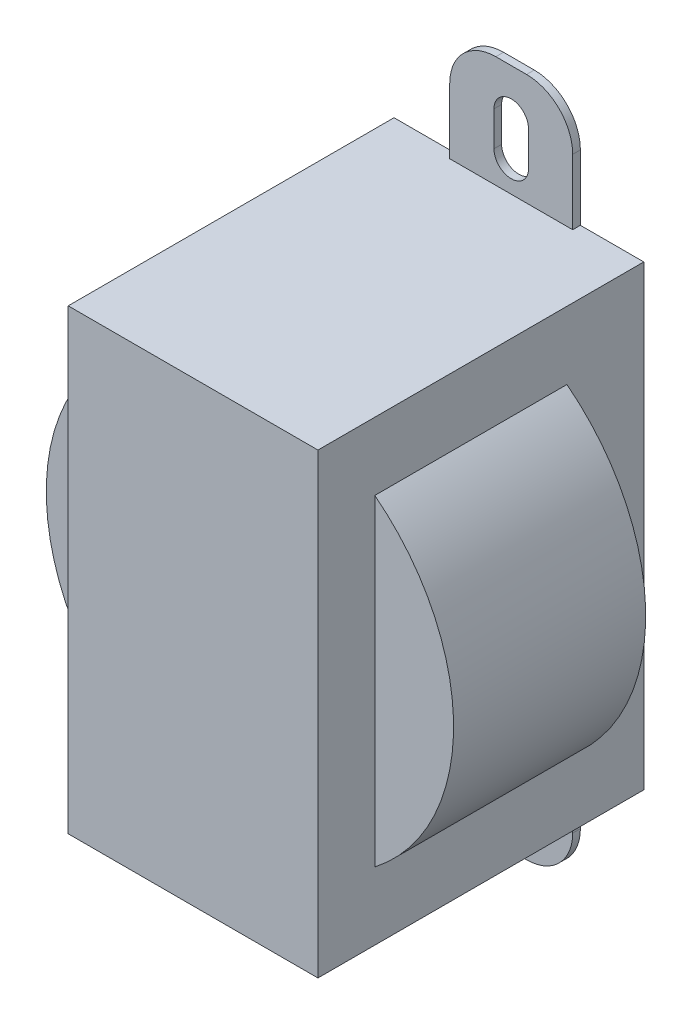
ISO-10303-21;
HEADER;
FILE_DESCRIPTION(('STEP AP214'),'2;1');
FILE_NAME('part.step','',(''),(''),'','','');
FILE_SCHEMA(('AUTOMOTIVE_DESIGN { 1 0 10303 214 1 1 1 1 }'));
ENDSEC;
DATA;
#1=APPLICATION_CONTEXT('core data for automotive mechanical design processes');
#2=APPLICATION_PROTOCOL_DEFINITION('international standard','automotive_design',2000,#1);
#3=PRODUCT_CONTEXT('',#1,'mechanical');
#4=PRODUCT('Part','Part','',(#3));
#5=PRODUCT_RELATED_PRODUCT_CATEGORY('part','',(#4));
#6=PRODUCT_DEFINITION_FORMATION('','',#4);
#7=PRODUCT_DEFINITION_CONTEXT('part definition',#1,'design');
#8=PRODUCT_DEFINITION('design','',#6,#7);
#9=PRODUCT_DEFINITION_SHAPE('','',#8);
#10=(LENGTH_UNIT() NAMED_UNIT(*) SI_UNIT(.MILLI.,.METRE.));
#11=(NAMED_UNIT(*) PLANE_ANGLE_UNIT() SI_UNIT($,.RADIAN.));
#12=(NAMED_UNIT(*) SI_UNIT($,.STERADIAN.) SOLID_ANGLE_UNIT());
#13=UNCERTAINTY_MEASURE_WITH_UNIT(LENGTH_MEASURE(1.E-05),#10,'distance_accuracy_value','');
#14=(GEOMETRIC_REPRESENTATION_CONTEXT(3) GLOBAL_UNCERTAINTY_ASSIGNED_CONTEXT((#13)) GLOBAL_UNIT_ASSIGNED_CONTEXT((#10,
#11,#12)) REPRESENTATION_CONTEXT('',''));
#15=CARTESIAN_POINT('',(0.,0.,0.));
#16=DIRECTION('',(0.,0.,1.));
#17=DIRECTION('',(1.,0.,0.));
#18=AXIS2_PLACEMENT_3D('',#15,#16,#17);
#19=CARTESIAN_POINT('',(-16.2500000000001,-29.7500000000001,42.4));
#20=DIRECTION('',(0.,1.,0.));
#21=DIRECTION('',(-1.,0.,0.));
#22=AXIS2_PLACEMENT_3D('',#19,#20,#21);
#23=PLANE('',#22);
#24=DIRECTION('',(0.,0.,-1.));
#25=VECTOR('',#24,1.);
#26=CARTESIAN_POINT('',(-7.99999999999999,-29.7500000000001,1.));
#27=LINE('',#26,#25);
#28=CARTESIAN_POINT('',(-7.99999999999999,-29.7500000000001,1.));
#29=VERTEX_POINT('',#28);
#30=CARTESIAN_POINT('',(-7.99999999999999,-29.7500000000001,0.));
#31=VERTEX_POINT('',#30);
#32=EDGE_CURVE('E299',#29,#31,#27,.T.);
#33=ORIENTED_EDGE('',*,*,#32,.F.);
#34=DIRECTION('',(-1.,0.,0.));
#35=VECTOR('',#34,1.);
#36=CARTESIAN_POINT('',(-7.99999999999999,-29.7500000000001,1.));
#37=LINE('',#36,#35);
#38=CARTESIAN_POINT('',(7.99999999999999,-29.7500000000002,1.));
#39=VERTEX_POINT('',#38);
#40=EDGE_CURVE('E282',#39,#29,#37,.T.);
#41=ORIENTED_EDGE('',*,*,#40,.F.);
#42=DIRECTION('',(0.,0.,-1.));
#43=VECTOR('',#42,1.);
#44=CARTESIAN_POINT('',(7.99999999999999,-29.7500000000002,1.));
#45=LINE('',#44,#43);
#46=CARTESIAN_POINT('',(7.99999999999999,-29.7500000000001,0.));
#47=VERTEX_POINT('',#46);
#48=EDGE_CURVE('E305',#39,#47,#45,.T.);
#49=ORIENTED_EDGE('',*,*,#48,.T.);
#50=DIRECTION('',(1.,0.,0.));
#51=VECTOR('',#50,1.);
#52=CARTESIAN_POINT('',(-16.2500000000001,-29.7500000000001,0.));
#53=LINE('',#52,#51);
#54=CARTESIAN_POINT('',(16.25,-29.7500000000001,0.));
#55=VERTEX_POINT('',#54);
#56=EDGE_CURVE('E308',#47,#55,#53,.T.);
#57=ORIENTED_EDGE('',*,*,#56,.T.);
#58=DIRECTION('',(0.,0.,-1.));
#59=VECTOR('',#58,1.);
#60=CARTESIAN_POINT('',(16.25,-29.7500000000001,42.4));
#61=LINE('',#60,#59);
#62=CARTESIAN_POINT('',(16.25,-29.7500000000001,42.4));
#63=VERTEX_POINT('',#62);
#64=EDGE_CURVE('E377',#63,#55,#61,.T.);
#65=ORIENTED_EDGE('',*,*,#64,.F.);
#66=DIRECTION('',(1.,0.,0.));
#67=VECTOR('',#66,1.);
#68=CARTESIAN_POINT('',(-16.2500000000001,-29.7500000000001,42.4));
#69=LINE('',#68,#67);
#70=CARTESIAN_POINT('',(-16.2500000000001,-29.7500000000001,42.4));
#71=VERTEX_POINT('',#70);
#72=EDGE_CURVE('E389',#71,#63,#69,.T.);
#73=ORIENTED_EDGE('',*,*,#72,.F.);
#74=DIRECTION('',(0.,0.,-1.));
#75=VECTOR('',#74,1.);
#76=CARTESIAN_POINT('',(-16.2500000000001,-29.7500000000001,42.4));
#77=LINE('',#76,#75);
#78=CARTESIAN_POINT('',(-16.2500000000001,-29.7500000000001,0.));
#79=VERTEX_POINT('',#78);
#80=EDGE_CURVE('E349',#71,#79,#77,.T.);
#81=ORIENTED_EDGE('',*,*,#80,.T.);
#82=EDGE_CURVE('E347',#79,#31,#53,.T.);
#83=ORIENTED_EDGE('',*,*,#82,.T.);
#84=EDGE_LOOP('',(#33,#41,#49,#57,#65,#73,#81,#83));
#85=FACE_BOUND('',#84,.T.);
#86=ADVANCED_FACE('F38',(#85),#23,.F.);
#87=CARTESIAN_POINT('',(-16.2500000000001,29.7500000000001,42.4));
#88=DIRECTION('',(0.,-1.,0.));
#89=DIRECTION('',(1.,0.,0.));
#90=AXIS2_PLACEMENT_3D('',#87,#88,#89);
#91=PLANE('',#90);
#92=DIRECTION('',(0.,0.,-1.));
#93=VECTOR('',#92,1.);
#94=CARTESIAN_POINT('',(7.99999999999999,29.7500000000001,0.999999999999999));
#95=LINE('',#94,#93);
#96=CARTESIAN_POINT('',(7.99999999999999,29.7500000000001,0.999999999999999));
#97=VERTEX_POINT('',#96);
#98=CARTESIAN_POINT('',(7.99999999999999,29.7500000000001,0.));
#99=VERTEX_POINT('',#98);
#100=EDGE_CURVE('E445',#97,#99,#95,.T.);
#101=ORIENTED_EDGE('',*,*,#100,.F.);
#102=DIRECTION('',(1.,0.,0.));
#103=VECTOR('',#102,1.);
#104=CARTESIAN_POINT('',(-7.99999999999999,29.7500000000001,1.));
#105=LINE('',#104,#103);
#106=CARTESIAN_POINT('',(-7.99999999999999,29.7500000000001,1.));
#107=VERTEX_POINT('',#106);
#108=EDGE_CURVE('E442',#107,#97,#105,.T.);
#109=ORIENTED_EDGE('',*,*,#108,.F.);
#110=DIRECTION('',(0.,0.,-1.));
#111=VECTOR('',#110,1.);
#112=CARTESIAN_POINT('',(-7.99999999999999,29.7500000000001,1.));
#113=LINE('',#112,#111);
#114=CARTESIAN_POINT('',(-7.99999999999999,29.7500000000001,0.));
#115=VERTEX_POINT('',#114);
#116=EDGE_CURVE('E439',#107,#115,#113,.T.);
#117=ORIENTED_EDGE('',*,*,#116,.T.);
#118=DIRECTION('',(-1.,0.,0.));
#119=VECTOR('',#118,1.);
#120=CARTESIAN_POINT('',(-16.2500000000001,29.7500000000001,0.));
#121=LINE('',#120,#119);
#122=CARTESIAN_POINT('',(-16.2500000000001,29.7500000000001,0.));
#123=VERTEX_POINT('',#122);
#124=EDGE_CURVE('E352',#115,#123,#121,.T.);
#125=ORIENTED_EDGE('',*,*,#124,.T.);
#126=DIRECTION('',(0.,0.,-1.));
#127=VECTOR('',#126,1.);
#128=CARTESIAN_POINT('',(-16.2500000000001,29.7500000000001,42.4));
#129=LINE('',#128,#127);
#130=CARTESIAN_POINT('',(-16.2500000000001,29.7500000000001,42.4));
#131=VERTEX_POINT('',#130);
#132=EDGE_CURVE('E383',#131,#123,#129,.T.);
#133=ORIENTED_EDGE('',*,*,#132,.F.);
#134=DIRECTION('',(-1.,0.,0.));
#135=VECTOR('',#134,1.);
#136=CARTESIAN_POINT('',(-16.2500000000001,29.7500000000001,42.4));
#137=LINE('',#136,#135);
#138=CARTESIAN_POINT('',(16.25,29.7500000000001,42.4));
#139=VERTEX_POINT('',#138);
#140=EDGE_CURVE('E386',#139,#131,#137,.T.);
#141=ORIENTED_EDGE('',*,*,#140,.F.);
#142=DIRECTION('',(0.,0.,-1.));
#143=VECTOR('',#142,1.);
#144=CARTESIAN_POINT('',(16.25,29.7500000000001,42.4));
#145=LINE('',#144,#143);
#146=CARTESIAN_POINT('',(16.25,29.7500000000001,0.));
#147=VERTEX_POINT('',#146);
#148=EDGE_CURVE('E380',#139,#147,#145,.T.);
#149=ORIENTED_EDGE('',*,*,#148,.T.);
#150=EDGE_CURVE('E371',#147,#99,#121,.T.);
#151=ORIENTED_EDGE('',*,*,#150,.T.);
#152=EDGE_LOOP('',(#101,#109,#117,#125,#133,#141,#149,#151));
#153=FACE_BOUND('',#152,.T.);
#154=ADVANCED_FACE('F491',(#153),#91,.F.);
#155=CARTESIAN_POINT('',(-16.2500000000001,29.7500000000001,42.4));
#156=DIRECTION('',(1.,0.,0.));
#157=DIRECTION('',(0.,1.,0.));
#158=AXIS2_PLACEMENT_3D('',#155,#156,#157);
#159=PLANE('',#158);
#160=DIRECTION('',(0.,0.,-1.));
#161=VECTOR('',#160,1.);
#162=CARTESIAN_POINT('',(-16.2500000000001,20.9329286054293,35.));
#163=LINE('',#162,#161);
#164=CARTESIAN_POINT('',(-16.2500000000001,20.9329286054293,35.));
#165=VERTEX_POINT('',#164);
#166=CARTESIAN_POINT('',(-16.2500000000001,20.9329286054293,10.));
#167=VERTEX_POINT('',#166);
#168=EDGE_CURVE('E414',#165,#167,#163,.T.);
#169=ORIENTED_EDGE('',*,*,#168,.F.);
#170=DIRECTION('',(0.,-1.,0.));
#171=VECTOR('',#170,1.);
#172=CARTESIAN_POINT('',(-16.2500000000001,29.7500000000001,35.));
#173=LINE('',#172,#171);
#174=CARTESIAN_POINT('',(-16.25,-20.9329286054293,35.));
#175=VERTEX_POINT('',#174);
#176=EDGE_CURVE('E399',#165,#175,#173,.T.);
#177=ORIENTED_EDGE('',*,*,#176,.T.);
#178=DIRECTION('',(0.,0.,-1.));
#179=VECTOR('',#178,1.);
#180=CARTESIAN_POINT('',(-16.2500000000001,-20.9329286054293,35.));
#181=LINE('',#180,#179);
#182=CARTESIAN_POINT('',(-16.2500000000001,-20.9329286054293,10.));
#183=VERTEX_POINT('',#182);
#184=EDGE_CURVE('E405',#175,#183,#181,.T.);
#185=ORIENTED_EDGE('',*,*,#184,.T.);
#186=DIRECTION('',(0.,-1.,0.));
#187=VECTOR('',#186,1.);
#188=CARTESIAN_POINT('',(-16.2500000000001,29.7500000000001,10.));
#189=LINE('',#188,#187);
#190=EDGE_CURVE('E400',#167,#183,#189,.T.);
#191=ORIENTED_EDGE('',*,*,#190,.F.);
#192=EDGE_LOOP('',(#169,#177,#185,#191));
#193=FACE_BOUND('',#192,.T.);
#194=DIRECTION('',(0.,-1.,0.));
#195=VECTOR('',#194,1.);
#196=CARTESIAN_POINT('',(-16.2500000000001,29.7500000000001,0.));
#197=LINE('',#196,#195);
#198=EDGE_CURVE('E354',#123,#79,#197,.T.);
#199=ORIENTED_EDGE('',*,*,#198,.T.);
#200=ORIENTED_EDGE('',*,*,#80,.F.);
#201=DIRECTION('',(0.,-1.,0.));
#202=VECTOR('',#201,1.);
#203=CARTESIAN_POINT('',(-16.2500000000001,29.7500000000001,42.4));
#204=LINE('',#203,#202);
#205=EDGE_CURVE('E365',#131,#71,#204,.T.);
#206=ORIENTED_EDGE('',*,*,#205,.F.);
#207=ORIENTED_EDGE('',*,*,#132,.T.);
#208=EDGE_LOOP('',(#199,#200,#206,#207));
#209=FACE_BOUND('',#208,.T.);
#210=ADVANCED_FACE('F40',(#193,#209),#159,.F.);
#211=CARTESIAN_POINT('',(16.25,29.7500000000001,42.4));
#212=DIRECTION('',(-1.,0.,0.));
#213=DIRECTION('',(0.,-1.,0.));
#214=AXIS2_PLACEMENT_3D('',#211,#212,#213);
#215=PLANE('',#214);
#216=DIRECTION('',(0.,0.,-1.));
#217=VECTOR('',#216,1.);
#218=CARTESIAN_POINT('',(16.25,-20.9329286054293,35.));
#219=LINE('',#218,#217);
#220=CARTESIAN_POINT('',(16.25,-20.9329286054293,35.));
#221=VERTEX_POINT('',#220);
#222=CARTESIAN_POINT('',(16.25,-20.9329286054293,10.));
#223=VERTEX_POINT('',#222);
#224=EDGE_CURVE('E409',#221,#223,#219,.T.);
#225=ORIENTED_EDGE('',*,*,#224,.F.);
#226=DIRECTION('',(0.,1.,0.));
#227=VECTOR('',#226,1.);
#228=CARTESIAN_POINT('',(16.25,29.7500000000001,35.));
#229=LINE('',#228,#227);
#230=CARTESIAN_POINT('',(16.25,20.9329286054293,35.));
#231=VERTEX_POINT('',#230);
#232=EDGE_CURVE('E11',#221,#231,#229,.T.);
#233=ORIENTED_EDGE('',*,*,#232,.T.);
#234=DIRECTION('',(0.,0.,-1.));
#235=VECTOR('',#234,1.);
#236=CARTESIAN_POINT('',(16.25,20.9329286054293,35.));
#237=LINE('',#236,#235);
#238=CARTESIAN_POINT('',(16.25,20.9329286054293,10.));
#239=VERTEX_POINT('',#238);
#240=EDGE_CURVE('E412',#231,#239,#237,.T.);
#241=ORIENTED_EDGE('',*,*,#240,.T.);
#242=DIRECTION('',(0.,1.,0.));
#243=VECTOR('',#242,1.);
#244=CARTESIAN_POINT('',(16.25,29.7500000000001,10.));
#245=LINE('',#244,#243);
#246=EDGE_CURVE('E47',#223,#239,#245,.T.);
#247=ORIENTED_EDGE('',*,*,#246,.F.);
#248=EDGE_LOOP('',(#225,#233,#241,#247));
#249=FACE_BOUND('',#248,.T.);
#250=DIRECTION('',(0.,1.,0.));
#251=VECTOR('',#250,1.);
#252=CARTESIAN_POINT('',(16.25,29.7500000000001,0.));
#253=LINE('',#252,#251);
#254=EDGE_CURVE('E351',#55,#147,#253,.T.);
#255=ORIENTED_EDGE('',*,*,#254,.T.);
#256=ORIENTED_EDGE('',*,*,#148,.F.);
#257=DIRECTION('',(0.,1.,0.));
#258=VECTOR('',#257,1.);
#259=CARTESIAN_POINT('',(16.25,29.7500000000001,42.4));
#260=LINE('',#259,#258);
#261=EDGE_CURVE('E388',#63,#139,#260,.T.);
#262=ORIENTED_EDGE('',*,*,#261,.F.);
#263=ORIENTED_EDGE('',*,*,#64,.T.);
#264=EDGE_LOOP('',(#255,#256,#262,#263));
#265=FACE_BOUND('',#264,.T.);
#266=ADVANCED_FACE('F527',(#249,#265),#215,.F.);
#267=CARTESIAN_POINT('',(-16.2500000000001,-29.7500000000001,42.4));
#268=DIRECTION('',(0.,0.,1.));
#269=DIRECTION('',(1.,0.,0.));
#270=AXIS2_PLACEMENT_3D('',#267,#268,#269);
#271=PLANE('',#270);
#272=ORIENTED_EDGE('',*,*,#205,.T.);
#273=ORIENTED_EDGE('',*,*,#72,.T.);
#274=ORIENTED_EDGE('',*,*,#261,.T.);
#275=ORIENTED_EDGE('',*,*,#140,.T.);
#276=EDGE_LOOP('',(#272,#273,#274,#275));
#277=FACE_BOUND('',#276,.T.);
#278=ADVANCED_FACE('F394',(#277),#271,.T.);
#279=CARTESIAN_POINT('',(-16.2500000000001,-29.7500000000001,0.));
#280=DIRECTION('',(0.,0.,1.));
#281=DIRECTION('',(1.,0.,0.));
#282=AXIS2_PLACEMENT_3D('',#279,#280,#281);
#283=PLANE('',#282);
#284=ORIENTED_EDGE('',*,*,#198,.F.);
#285=ORIENTED_EDGE('',*,*,#124,.F.);
#286=DIRECTION('',(0.,-1.,0.));
#287=VECTOR('',#286,1.);
#288=CARTESIAN_POINT('',(-8.,38.2500000000001,0.));
#289=LINE('',#288,#287);
#290=CARTESIAN_POINT('',(-8.,38.2500000000001,0.));
#291=VERTEX_POINT('',#290);
#292=EDGE_CURVE('E63',#291,#115,#289,.T.);
#293=ORIENTED_EDGE('',*,*,#292,.F.);
#294=CARTESIAN_POINT('',(-2.,38.2500000000001,0.));
#295=DIRECTION('',(0.,0.,1.));
#296=DIRECTION('',(-1.,0.,0.));
#297=AXIS2_PLACEMENT_3D('',#294,#295,#296);
#298=CIRCLE('',#297,6.);
#299=CARTESIAN_POINT('',(-1.99999999999996,44.2500000000001,0.));
#300=VERTEX_POINT('',#299);
#301=EDGE_CURVE('E448',#300,#291,#298,.T.);
#302=ORIENTED_EDGE('',*,*,#301,.F.);
#303=DIRECTION('',(-1.,0.,0.));
#304=VECTOR('',#303,1.);
#305=CARTESIAN_POINT('',(-1.99999999999996,44.2500000000001,0.));
#306=LINE('',#305,#304);
#307=CARTESIAN_POINT('',(1.99999999999999,44.2500000000001,0.));
#308=VERTEX_POINT('',#307);
#309=EDGE_CURVE('E460',#308,#300,#306,.T.);
#310=ORIENTED_EDGE('',*,*,#309,.F.);
#311=CARTESIAN_POINT('',(1.99999999999999,38.2500000000001,0.));
#312=DIRECTION('',(0.,0.,1.));
#313=DIRECTION('',(1.,0.,0.));
#314=AXIS2_PLACEMENT_3D('',#311,#312,#313);
#315=CIRCLE('',#314,6.);
#316=CARTESIAN_POINT('',(7.99999999999999,38.2500000000001,0.));
#317=VERTEX_POINT('',#316);
#318=EDGE_CURVE('E455',#317,#308,#315,.T.);
#319=ORIENTED_EDGE('',*,*,#318,.F.);
#320=DIRECTION('',(0.,1.,0.));
#321=VECTOR('',#320,1.);
#322=CARTESIAN_POINT('',(7.99999999999999,38.2500000000001,0.));
#323=LINE('',#322,#321);
#324=EDGE_CURVE('E453',#99,#317,#323,.T.);
#325=ORIENTED_EDGE('',*,*,#324,.F.);
#326=ORIENTED_EDGE('',*,*,#150,.F.);
#327=ORIENTED_EDGE('',*,*,#254,.F.);
#328=ORIENTED_EDGE('',*,*,#56,.F.);
#329=DIRECTION('',(0.,1.,0.));
#330=VECTOR('',#329,1.);
#331=CARTESIAN_POINT('',(7.99999999999999,-38.2500000000001,0.));
#332=LINE('',#331,#330);
#333=CARTESIAN_POINT('',(7.99999999999999,-38.2500000000001,0.));
#334=VERTEX_POINT('',#333);
#335=EDGE_CURVE('E55',#334,#47,#332,.T.);
#336=ORIENTED_EDGE('',*,*,#335,.F.);
#337=CARTESIAN_POINT('',(1.99999999999999,-38.2500000000001,0.));
#338=DIRECTION('',(0.,0.,1.));
#339=DIRECTION('',(-1.,0.,0.));
#340=AXIS2_PLACEMENT_3D('',#337,#338,#339);
#341=CIRCLE('',#340,6.);
#342=CARTESIAN_POINT('',(1.99999999999999,-44.2500000000001,0.));
#343=VERTEX_POINT('',#342);
#344=EDGE_CURVE('E247',#343,#334,#341,.T.);
#345=ORIENTED_EDGE('',*,*,#344,.F.);
#346=DIRECTION('',(1.,0.,0.));
#347=VECTOR('',#346,1.);
#348=CARTESIAN_POINT('',(-1.99999999999996,-44.2500000000001,0.));
#349=LINE('',#348,#347);
#350=CARTESIAN_POINT('',(-1.99999999999996,-44.2500000000001,0.));
#351=VERTEX_POINT('',#350);
#352=EDGE_CURVE('E274',#351,#343,#349,.T.);
#353=ORIENTED_EDGE('',*,*,#352,.F.);
#354=CARTESIAN_POINT('',(-2.,-38.2500000000001,0.));
#355=DIRECTION('',(0.,0.,1.));
#356=DIRECTION('',(1.,0.,0.));
#357=AXIS2_PLACEMENT_3D('',#354,#355,#356);
#358=CIRCLE('',#357,6.);
#359=CARTESIAN_POINT('',(-8.,-38.2500000000001,0.));
#360=VERTEX_POINT('',#359);
#361=EDGE_CURVE('E272',#360,#351,#358,.T.);
#362=ORIENTED_EDGE('',*,*,#361,.F.);
#363=DIRECTION('',(0.,-1.,0.));
#364=VECTOR('',#363,1.);
#365=CARTESIAN_POINT('',(-8.,-38.2500000000001,0.));
#366=LINE('',#365,#364);
#367=EDGE_CURVE('E275',#31,#360,#366,.T.);
#368=ORIENTED_EDGE('',*,*,#367,.F.);
#369=ORIENTED_EDGE('',*,*,#82,.F.);
#370=EDGE_LOOP('',(#284,#285,#293,#302,#310,#319,#325,#326,#327,#328,#336,#345,#353,#362,#368,#369));
#371=FACE_BOUND('',#370,.T.);
#372=DIRECTION('',(0.,1.,0.));
#373=VECTOR('',#372,1.);
#374=CARTESIAN_POINT('',(2.25,38.2500000000001,0.));
#375=LINE('',#374,#373);
#376=CARTESIAN_POINT('',(2.25,33.7500000000001,0.));
#377=VERTEX_POINT('',#376);
#378=CARTESIAN_POINT('',(2.25,38.2500000000001,0.));
#379=VERTEX_POINT('',#378);
#380=EDGE_CURVE('E809',#377,#379,#375,.T.);
#381=ORIENTED_EDGE('',*,*,#380,.T.);
#382=CARTESIAN_POINT('',(0.,38.2500000000001,0.));
#383=DIRECTION('',(0.,0.,1.));
#384=DIRECTION('',(1.,0.,0.));
#385=AXIS2_PLACEMENT_3D('',#382,#383,#384);
#386=CIRCLE('',#385,2.25);
#387=CARTESIAN_POINT('',(-2.25,38.2500000000001,0.));
#388=VERTEX_POINT('',#387);
#389=EDGE_CURVE('E800',#379,#388,#386,.T.);
#390=ORIENTED_EDGE('',*,*,#389,.T.);
#391=DIRECTION('',(0.,-1.,0.));
#392=VECTOR('',#391,1.);
#393=CARTESIAN_POINT('',(-2.25,38.2500000000001,0.));
#394=LINE('',#393,#392);
#395=CARTESIAN_POINT('',(-2.25,33.7500000000001,0.));
#396=VERTEX_POINT('',#395);
#397=EDGE_CURVE('E801',#388,#396,#394,.T.);
#398=ORIENTED_EDGE('',*,*,#397,.T.);
#399=CARTESIAN_POINT('',(0.,33.7500000000001,0.));
#400=DIRECTION('',(0.,0.,1.));
#401=DIRECTION('',(1.,0.,0.));
#402=AXIS2_PLACEMENT_3D('',#399,#400,#401);
#403=CIRCLE('',#402,2.25);
#404=EDGE_CURVE('E804',#396,#377,#403,.T.);
#405=ORIENTED_EDGE('',*,*,#404,.T.);
#406=EDGE_LOOP('',(#381,#390,#398,#405));
#407=FACE_BOUND('',#406,.T.);
#408=DIRECTION('',(0.,-1.,0.));
#409=VECTOR('',#408,1.);
#410=CARTESIAN_POINT('',(-2.25,-38.2500000000001,0.));
#411=LINE('',#410,#409);
#412=CARTESIAN_POINT('',(-2.24999999999999,-33.7500000000001,0.));
#413=VERTEX_POINT('',#412);
#414=CARTESIAN_POINT('',(-2.25,-38.2500000000001,0.));
#415=VERTEX_POINT('',#414);
#416=EDGE_CURVE('E252',#413,#415,#411,.T.);
#417=ORIENTED_EDGE('',*,*,#416,.T.);
#418=CARTESIAN_POINT('',(0.,-38.2500000000001,0.));
#419=DIRECTION('',(0.,0.,1.));
#420=DIRECTION('',(-1.,0.,0.));
#421=AXIS2_PLACEMENT_3D('',#418,#419,#420);
#422=CIRCLE('',#421,2.25);
#423=CARTESIAN_POINT('',(2.25,-38.2500000000001,0.));
#424=VERTEX_POINT('',#423);
#425=EDGE_CURVE('E239',#415,#424,#422,.T.);
#426=ORIENTED_EDGE('',*,*,#425,.T.);
#427=DIRECTION('',(0.,1.,0.));
#428=VECTOR('',#427,1.);
#429=CARTESIAN_POINT('',(2.25,-38.2500000000001,0.));
#430=LINE('',#429,#428);
#431=CARTESIAN_POINT('',(2.25,-33.7500000000001,0.));
#432=VERTEX_POINT('',#431);
#433=EDGE_CURVE('E227',#424,#432,#430,.T.);
#434=ORIENTED_EDGE('',*,*,#433,.T.);
#435=CARTESIAN_POINT('',(0.,-33.7500000000001,0.));
#436=DIRECTION('',(0.,0.,1.));
#437=DIRECTION('',(-1.,0.,0.));
#438=AXIS2_PLACEMENT_3D('',#435,#436,#437);
#439=CIRCLE('',#438,2.25);
#440=EDGE_CURVE('E238',#432,#413,#439,.T.);
#441=ORIENTED_EDGE('',*,*,#440,.T.);
#442=EDGE_LOOP('',(#417,#426,#434,#441));
#443=FACE_BOUND('',#442,.T.);
#444=ADVANCED_FACE('F250',(#371,#407,#443),#283,.F.);
#445=CARTESIAN_POINT('',(0.,0.,35.));
#446=DIRECTION('',(0.,0.,1.));
#447=DIRECTION('',(1.,0.,0.));
#448=AXIS2_PLACEMENT_3D('',#445,#446,#447);
#449=PLANE('',#448);
#450=ORIENTED_EDGE('',*,*,#232,.F.);
#451=CARTESIAN_POINT('',(0.,0.,35.));
#452=DIRECTION('',(0.,0.,1.));
#453=DIRECTION('',(1.,0.,0.));
#454=AXIS2_PLACEMENT_3D('',#451,#452,#453);
#455=CIRCLE('',#454,26.5);
#456=EDGE_CURVE('E417',#221,#231,#455,.T.);
#457=ORIENTED_EDGE('',*,*,#456,.T.);
#458=EDGE_LOOP('',(#450,#457));
#459=FACE_BOUND('',#458,.T.);
#460=ADVANCED_FACE('F535',(#459),#449,.T.);
#461=CARTESIAN_POINT('',(0.,0.,10.));
#462=DIRECTION('',(0.,0.,1.));
#463=DIRECTION('',(1.,0.,0.));
#464=AXIS2_PLACEMENT_3D('',#461,#462,#463);
#465=PLANE('',#464);
#466=CARTESIAN_POINT('',(0.,0.,10.));
#467=DIRECTION('',(0.,0.,1.));
#468=DIRECTION('',(1.,0.,0.));
#469=AXIS2_PLACEMENT_3D('',#466,#467,#468);
#470=CIRCLE('',#469,26.5);
#471=EDGE_CURVE('E422',#223,#239,#470,.T.);
#472=ORIENTED_EDGE('',*,*,#471,.F.);
#473=ORIENTED_EDGE('',*,*,#246,.T.);
#474=EDGE_LOOP('',(#472,#473));
#475=FACE_BOUND('',#474,.T.);
#476=ADVANCED_FACE('F545',(#475),#465,.F.);
#477=CARTESIAN_POINT('',(0.,0.,35.));
#478=DIRECTION('',(0.,0.,-1.));
#479=DIRECTION('',(-1.,0.,0.));
#480=AXIS2_PLACEMENT_3D('',#477,#478,#479);
#481=CYLINDRICAL_SURFACE('',#480,26.5);
#482=ORIENTED_EDGE('',*,*,#471,.T.);
#483=ORIENTED_EDGE('',*,*,#240,.F.);
#484=ORIENTED_EDGE('',*,*,#456,.F.);
#485=ORIENTED_EDGE('',*,*,#224,.T.);
#486=EDGE_LOOP('',(#482,#483,#484,#485));
#487=FACE_BOUND('',#486,.T.);
#488=ADVANCED_FACE('F541',(#487),#481,.T.);
#489=ORIENTED_EDGE('',*,*,#176,.F.);
#490=CARTESIAN_POINT('',(0.,0.,35.));
#491=DIRECTION('',(0.,0.,1.));
#492=DIRECTION('',(1.,0.,0.));
#493=AXIS2_PLACEMENT_3D('',#490,#491,#492);
#494=CIRCLE('',#493,26.5);
#495=EDGE_CURVE('E420',#165,#175,#494,.T.);
#496=ORIENTED_EDGE('',*,*,#495,.T.);
#497=EDGE_LOOP('',(#489,#496));
#498=FACE_BOUND('',#497,.T.);
#499=ADVANCED_FACE('F544',(#498),#449,.T.);
#500=CARTESIAN_POINT('',(0.,0.,10.));
#501=DIRECTION('',(0.,0.,1.));
#502=DIRECTION('',(1.,0.,0.));
#503=AXIS2_PLACEMENT_3D('',#500,#501,#502);
#504=CIRCLE('',#503,26.5);
#505=EDGE_CURVE('E425',#167,#183,#504,.T.);
#506=ORIENTED_EDGE('',*,*,#505,.F.);
#507=ORIENTED_EDGE('',*,*,#190,.T.);
#508=EDGE_LOOP('',(#506,#507));
#509=FACE_BOUND('',#508,.T.);
#510=ADVANCED_FACE('F539',(#509),#465,.F.);
#511=CARTESIAN_POINT('',(0.,0.,35.));
#512=DIRECTION('',(0.,0.,-1.));
#513=DIRECTION('',(-1.,0.,0.));
#514=AXIS2_PLACEMENT_3D('',#511,#512,#513);
#515=CYLINDRICAL_SURFACE('',#514,26.5);
#516=ORIENTED_EDGE('',*,*,#505,.T.);
#517=ORIENTED_EDGE('',*,*,#184,.F.);
#518=ORIENTED_EDGE('',*,*,#495,.F.);
#519=ORIENTED_EDGE('',*,*,#168,.T.);
#520=EDGE_LOOP('',(#516,#517,#518,#519));
#521=FACE_BOUND('',#520,.T.);
#522=ADVANCED_FACE('F536',(#521),#515,.T.);
#523=CARTESIAN_POINT('',(-2.,38.2500000000001,1.));
#524=DIRECTION('',(0.,0.,-1.));
#525=DIRECTION('',(-1.,0.,0.));
#526=AXIS2_PLACEMENT_3D('',#523,#524,#525);
#527=PLANE('',#526);
#528=DIRECTION('',(0.,1.,0.));
#529=VECTOR('',#528,1.);
#530=CARTESIAN_POINT('',(7.99999999999999,38.2500000000001,0.999999999999999));
#531=LINE('',#530,#529);
#532=CARTESIAN_POINT('',(7.99999999999999,38.2500000000001,0.999999999999999));
#533=VERTEX_POINT('',#532);
#534=EDGE_CURVE('E447',#97,#533,#531,.T.);
#535=ORIENTED_EDGE('',*,*,#534,.T.);
#536=CARTESIAN_POINT('',(1.99999999999999,38.2500000000001,1.));
#537=DIRECTION('',(0.,0.,1.));
#538=DIRECTION('',(1.,0.,0.));
#539=AXIS2_PLACEMENT_3D('',#536,#537,#538);
#540=CIRCLE('',#539,6.);
#541=CARTESIAN_POINT('',(1.99999999999999,44.2500000000001,1.));
#542=VERTEX_POINT('',#541);
#543=EDGE_CURVE('E476',#533,#542,#540,.T.);
#544=ORIENTED_EDGE('',*,*,#543,.T.);
#545=DIRECTION('',(-1.,0.,0.));
#546=VECTOR('',#545,1.);
#547=CARTESIAN_POINT('',(-1.99999999999996,44.2500000000001,1.));
#548=LINE('',#547,#546);
#549=CARTESIAN_POINT('',(-1.99999999999996,44.2500000000001,1.));
#550=VERTEX_POINT('',#549);
#551=EDGE_CURVE('E478',#542,#550,#548,.T.);
#552=ORIENTED_EDGE('',*,*,#551,.T.);
#553=CARTESIAN_POINT('',(-2.,38.2500000000001,1.));
#554=DIRECTION('',(0.,0.,1.));
#555=DIRECTION('',(-1.,0.,0.));
#556=AXIS2_PLACEMENT_3D('',#553,#554,#555);
#557=CIRCLE('',#556,6.);
#558=CARTESIAN_POINT('',(-8.,38.25,1.));
#559=VERTEX_POINT('',#558);
#560=EDGE_CURVE('E480',#550,#559,#557,.T.);
#561=ORIENTED_EDGE('',*,*,#560,.T.);
#562=DIRECTION('',(0.,-1.,0.));
#563=VECTOR('',#562,1.);
#564=CARTESIAN_POINT('',(-8.,38.25,1.));
#565=LINE('',#564,#563);
#566=EDGE_CURVE('E481',#559,#107,#565,.T.);
#567=ORIENTED_EDGE('',*,*,#566,.T.);
#568=ORIENTED_EDGE('',*,*,#108,.T.);
#569=EDGE_LOOP('',(#535,#544,#552,#561,#567,#568));
#570=FACE_BOUND('',#569,.T.);
#571=CARTESIAN_POINT('',(0.,38.2500000000001,1.));
#572=DIRECTION('',(0.,0.,1.));
#573=DIRECTION('',(1.,0.,0.));
#574=AXIS2_PLACEMENT_3D('',#571,#572,#573);
#575=CIRCLE('',#574,2.25);
#576=CARTESIAN_POINT('',(2.25,38.2500000000001,1.));
#577=VERTEX_POINT('',#576);
#578=CARTESIAN_POINT('',(-2.25,38.2500000000001,1.));
#579=VERTEX_POINT('',#578);
#580=EDGE_CURVE('E811',#577,#579,#575,.T.);
#581=ORIENTED_EDGE('',*,*,#580,.F.);
#582=DIRECTION('',(0.,1.,0.));
#583=VECTOR('',#582,1.);
#584=CARTESIAN_POINT('',(2.25,38.2500000000001,1.));
#585=LINE('',#584,#583);
#586=CARTESIAN_POINT('',(2.25,33.7500000000001,1.));
#587=VERTEX_POINT('',#586);
#588=EDGE_CURVE('E818',#587,#577,#585,.T.);
#589=ORIENTED_EDGE('',*,*,#588,.F.);
#590=CARTESIAN_POINT('',(0.,33.7500000000001,1.));
#591=DIRECTION('',(0.,0.,1.));
#592=DIRECTION('',(1.,0.,0.));
#593=AXIS2_PLACEMENT_3D('',#590,#591,#592);
#594=CIRCLE('',#593,2.25);
#595=CARTESIAN_POINT('',(-2.25,33.7500000000001,1.));
#596=VERTEX_POINT('',#595);
#597=EDGE_CURVE('E815',#596,#587,#594,.T.);
#598=ORIENTED_EDGE('',*,*,#597,.F.);
#599=DIRECTION('',(0.,-1.,0.));
#600=VECTOR('',#599,1.);
#601=CARTESIAN_POINT('',(-2.25,38.2500000000001,1.));
#602=LINE('',#601,#600);
#603=EDGE_CURVE('E813',#579,#596,#602,.T.);
#604=ORIENTED_EDGE('',*,*,#603,.F.);
#605=EDGE_LOOP('',(#581,#589,#598,#604));
#606=FACE_BOUND('',#605,.T.);
#607=ADVANCED_FACE('F486',(#570,#606),#527,.F.);
#608=CARTESIAN_POINT('',(7.99999999999999,38.2500000000001,0.999999999999999));
#609=DIRECTION('',(-1.,0.,0.));
#610=DIRECTION('',(0.,-1.,0.));
#611=AXIS2_PLACEMENT_3D('',#608,#609,#610);
#612=PLANE('',#611);
#613=ORIENTED_EDGE('',*,*,#324,.T.);
#614=DIRECTION('',(0.,0.,-1.));
#615=VECTOR('',#614,1.);
#616=CARTESIAN_POINT('',(7.99999999999999,38.2500000000001,0.999999999999999));
#617=LINE('',#616,#615);
#618=EDGE_CURVE('E428',#533,#317,#617,.T.);
#619=ORIENTED_EDGE('',*,*,#618,.F.);
#620=ORIENTED_EDGE('',*,*,#534,.F.);
#621=ORIENTED_EDGE('',*,*,#100,.T.);
#622=EDGE_LOOP('',(#613,#619,#620,#621));
#623=FACE_BOUND('',#622,.T.);
#624=ADVANCED_FACE('F490',(#623),#612,.F.);
#625=CARTESIAN_POINT('',(1.99999999999999,38.2500000000001,1.));
#626=DIRECTION('',(0.,0.,-1.));
#627=DIRECTION('',(-1.,0.,0.));
#628=AXIS2_PLACEMENT_3D('',#625,#626,#627);
#629=CYLINDRICAL_SURFACE('',#628,6.);
#630=ORIENTED_EDGE('',*,*,#318,.T.);
#631=DIRECTION('',(0.,0.,-1.));
#632=VECTOR('',#631,1.);
#633=CARTESIAN_POINT('',(1.99999999999999,44.2500000000001,1.));
#634=LINE('',#633,#632);
#635=EDGE_CURVE('E431',#542,#308,#634,.T.);
#636=ORIENTED_EDGE('',*,*,#635,.F.);
#637=ORIENTED_EDGE('',*,*,#543,.F.);
#638=ORIENTED_EDGE('',*,*,#618,.T.);
#639=EDGE_LOOP('',(#630,#636,#637,#638));
#640=FACE_BOUND('',#639,.T.);
#641=ADVANCED_FACE('F500',(#640),#629,.T.);
#642=CARTESIAN_POINT('',(-1.99999999999996,44.2500000000001,1.));
#643=DIRECTION('',(0.,-1.,0.));
#644=DIRECTION('',(0.,0.,-1.));
#645=AXIS2_PLACEMENT_3D('',#642,#643,#644);
#646=PLANE('',#645);
#647=ORIENTED_EDGE('',*,*,#309,.T.);
#648=DIRECTION('',(0.,0.,-1.));
#649=VECTOR('',#648,1.);
#650=CARTESIAN_POINT('',(-1.99999999999996,44.2500000000001,1.));
#651=LINE('',#650,#649);
#652=EDGE_CURVE('E434',#550,#300,#651,.T.);
#653=ORIENTED_EDGE('',*,*,#652,.F.);
#654=ORIENTED_EDGE('',*,*,#551,.F.);
#655=ORIENTED_EDGE('',*,*,#635,.T.);
#656=EDGE_LOOP('',(#647,#653,#654,#655));
#657=FACE_BOUND('',#656,.T.);
#658=ADVANCED_FACE('F506',(#657),#646,.F.);
#659=CARTESIAN_POINT('',(-2.,38.2500000000001,1.));
#660=DIRECTION('',(0.,0.,-1.));
#661=DIRECTION('',(-1.,0.,0.));
#662=AXIS2_PLACEMENT_3D('',#659,#660,#661);
#663=CYLINDRICAL_SURFACE('',#662,6.);
#664=ORIENTED_EDGE('',*,*,#301,.T.);
#665=DIRECTION('',(0.,0.,-1.));
#666=VECTOR('',#665,1.);
#667=CARTESIAN_POINT('',(-8.,38.25,1.));
#668=LINE('',#667,#666);
#669=EDGE_CURVE('E437',#559,#291,#668,.T.);
#670=ORIENTED_EDGE('',*,*,#669,.F.);
#671=ORIENTED_EDGE('',*,*,#560,.F.);
#672=ORIENTED_EDGE('',*,*,#652,.T.);
#673=EDGE_LOOP('',(#664,#670,#671,#672));
#674=FACE_BOUND('',#673,.T.);
#675=ADVANCED_FACE('F508',(#674),#663,.T.);
#676=CARTESIAN_POINT('',(-8.,38.25,1.));
#677=DIRECTION('',(1.,0.,0.));
#678=DIRECTION('',(0.,1.,0.));
#679=AXIS2_PLACEMENT_3D('',#676,#677,#678);
#680=PLANE('',#679);
#681=ORIENTED_EDGE('',*,*,#292,.T.);
#682=ORIENTED_EDGE('',*,*,#116,.F.);
#683=ORIENTED_EDGE('',*,*,#566,.F.);
#684=ORIENTED_EDGE('',*,*,#669,.T.);
#685=EDGE_LOOP('',(#681,#682,#683,#684));
#686=FACE_BOUND('',#685,.T.);
#687=ADVANCED_FACE('F509',(#686),#680,.F.);
#688=CARTESIAN_POINT('',(0.,38.2500000000001,1.));
#689=DIRECTION('',(0.,0.,-1.));
#690=DIRECTION('',(-1.,0.,0.));
#691=AXIS2_PLACEMENT_3D('',#688,#689,#690);
#692=CYLINDRICAL_SURFACE('',#691,2.25);
#693=ORIENTED_EDGE('',*,*,#389,.F.);
#694=DIRECTION('',(0.,0.,-1.));
#695=VECTOR('',#694,1.);
#696=CARTESIAN_POINT('',(2.25,38.2500000000001,1.));
#697=LINE('',#696,#695);
#698=EDGE_CURVE('E820',#577,#379,#697,.T.);
#699=ORIENTED_EDGE('',*,*,#698,.F.);
#700=ORIENTED_EDGE('',*,*,#580,.T.);
#701=DIRECTION('',(0.,0.,-1.));
#702=VECTOR('',#701,1.);
#703=CARTESIAN_POINT('',(-2.25,38.2500000000001,1.));
#704=LINE('',#703,#702);
#705=EDGE_CURVE('E456',#579,#388,#704,.T.);
#706=ORIENTED_EDGE('',*,*,#705,.T.);
#707=EDGE_LOOP('',(#693,#699,#700,#706));
#708=FACE_BOUND('',#707,.T.);
#709=ADVANCED_FACE('F511',(#708),#692,.F.);
#710=CARTESIAN_POINT('',(-2.25,38.2500000000001,1.));
#711=DIRECTION('',(1.,0.,0.));
#712=DIRECTION('',(0.,1.,0.));
#713=AXIS2_PLACEMENT_3D('',#710,#711,#712);
#714=PLANE('',#713);
#715=ORIENTED_EDGE('',*,*,#397,.F.);
#716=ORIENTED_EDGE('',*,*,#705,.F.);
#717=ORIENTED_EDGE('',*,*,#603,.T.);
#718=DIRECTION('',(0.,0.,-1.));
#719=VECTOR('',#718,1.);
#720=CARTESIAN_POINT('',(-2.25,33.7500000000001,1.));
#721=LINE('',#720,#719);
#722=EDGE_CURVE('E463',#596,#396,#721,.T.);
#723=ORIENTED_EDGE('',*,*,#722,.T.);
#724=EDGE_LOOP('',(#715,#716,#717,#723));
#725=FACE_BOUND('',#724,.T.);
#726=ADVANCED_FACE('F517',(#725),#714,.T.);
#727=CARTESIAN_POINT('',(0.,33.7500000000001,1.));
#728=DIRECTION('',(0.,0.,-1.));
#729=DIRECTION('',(-1.,0.,0.));
#730=AXIS2_PLACEMENT_3D('',#727,#728,#729);
#731=CYLINDRICAL_SURFACE('',#730,2.25);
#732=ORIENTED_EDGE('',*,*,#404,.F.);
#733=ORIENTED_EDGE('',*,*,#722,.F.);
#734=ORIENTED_EDGE('',*,*,#597,.T.);
#735=DIRECTION('',(0.,0.,-1.));
#736=VECTOR('',#735,1.);
#737=CARTESIAN_POINT('',(2.25,33.7500000000001,1.));
#738=LINE('',#737,#736);
#739=EDGE_CURVE('E468',#587,#377,#738,.T.);
#740=ORIENTED_EDGE('',*,*,#739,.T.);
#741=EDGE_LOOP('',(#732,#733,#734,#740));
#742=FACE_BOUND('',#741,.T.);
#743=ADVANCED_FACE('F585',(#742),#731,.F.);
#744=CARTESIAN_POINT('',(2.25,38.2500000000001,1.));
#745=DIRECTION('',(-1.,0.,0.));
#746=DIRECTION('',(0.,-1.,0.));
#747=AXIS2_PLACEMENT_3D('',#744,#745,#746);
#748=PLANE('',#747);
#749=ORIENTED_EDGE('',*,*,#380,.F.);
#750=ORIENTED_EDGE('',*,*,#739,.F.);
#751=ORIENTED_EDGE('',*,*,#588,.T.);
#752=ORIENTED_EDGE('',*,*,#698,.T.);
#753=EDGE_LOOP('',(#749,#750,#751,#752));
#754=FACE_BOUND('',#753,.T.);
#755=ADVANCED_FACE('F595',(#754),#748,.T.);
#756=CARTESIAN_POINT('',(1.99999999999999,-38.2500000000001,1.));
#757=DIRECTION('',(0.,0.,-1.));
#758=DIRECTION('',(-1.,0.,0.));
#759=AXIS2_PLACEMENT_3D('',#756,#757,#758);
#760=PLANE('',#759);
#761=CARTESIAN_POINT('',(1.99999999999999,-38.2500000000001,1.));
#762=DIRECTION('',(0.,0.,1.));
#763=DIRECTION('',(-1.,0.,0.));
#764=AXIS2_PLACEMENT_3D('',#761,#762,#763);
#765=CIRCLE('',#764,6.);
#766=CARTESIAN_POINT('',(1.99999999999999,-44.2500000000001,1.));
#767=VERTEX_POINT('',#766);
#768=CARTESIAN_POINT('',(7.99999999999999,-38.2500000000001,1.));
#769=VERTEX_POINT('',#768);
#770=EDGE_CURVE('E277',#767,#769,#765,.T.);
#771=ORIENTED_EDGE('',*,*,#770,.T.);
#772=DIRECTION('',(0.,1.,0.));
#773=VECTOR('',#772,1.);
#774=CARTESIAN_POINT('',(7.99999999999999,-38.2500000000001,1.));
#775=LINE('',#774,#773);
#776=EDGE_CURVE('E280',#769,#39,#775,.T.);
#777=ORIENTED_EDGE('',*,*,#776,.T.);
#778=ORIENTED_EDGE('',*,*,#40,.T.);
#779=DIRECTION('',(0.,-1.,0.));
#780=VECTOR('',#779,1.);
#781=CARTESIAN_POINT('',(-8.,-38.2500000000001,1.));
#782=LINE('',#781,#780);
#783=CARTESIAN_POINT('',(-8.,-38.2500000000001,1.));
#784=VERTEX_POINT('',#783);
#785=EDGE_CURVE('E284',#29,#784,#782,.T.);
#786=ORIENTED_EDGE('',*,*,#785,.T.);
#787=CARTESIAN_POINT('',(-2.,-38.2500000000001,1.));
#788=DIRECTION('',(0.,0.,1.));
#789=DIRECTION('',(1.,0.,0.));
#790=AXIS2_PLACEMENT_3D('',#787,#788,#789);
#791=CIRCLE('',#790,6.);
#792=CARTESIAN_POINT('',(-1.99999999999996,-44.2500000000001,1.));
#793=VERTEX_POINT('',#792);
#794=EDGE_CURVE('E286',#784,#793,#791,.T.);
#795=ORIENTED_EDGE('',*,*,#794,.T.);
#796=DIRECTION('',(1.,0.,0.));
#797=VECTOR('',#796,1.);
#798=CARTESIAN_POINT('',(-1.99999999999996,-44.2500000000001,1.));
#799=LINE('',#798,#797);
#800=EDGE_CURVE('E288',#793,#767,#799,.T.);
#801=ORIENTED_EDGE('',*,*,#800,.T.);
#802=EDGE_LOOP('',(#771,#777,#778,#786,#795,#801));
#803=FACE_BOUND('',#802,.T.);
#804=CARTESIAN_POINT('',(0.,-38.2500000000001,1.));
#805=DIRECTION('',(0.,0.,1.));
#806=DIRECTION('',(-1.,0.,0.));
#807=AXIS2_PLACEMENT_3D('',#804,#805,#806);
#808=CIRCLE('',#807,2.25);
#809=CARTESIAN_POINT('',(-2.25,-38.2500000000001,1.));
#810=VERTEX_POINT('',#809);
#811=CARTESIAN_POINT('',(2.25,-38.2500000000001,1.));
#812=VERTEX_POINT('',#811);
#813=EDGE_CURVE('E246',#810,#812,#808,.T.);
#814=ORIENTED_EDGE('',*,*,#813,.F.);
#815=DIRECTION('',(0.,-1.,0.));
#816=VECTOR('',#815,1.);
#817=CARTESIAN_POINT('',(-2.25,-38.2500000000001,1.));
#818=LINE('',#817,#816);
#819=CARTESIAN_POINT('',(-2.25,-33.7500000000001,1.));
#820=VERTEX_POINT('',#819);
#821=EDGE_CURVE('E263',#820,#810,#818,.T.);
#822=ORIENTED_EDGE('',*,*,#821,.F.);
#823=CARTESIAN_POINT('',(0.,-33.7500000000001,1.));
#824=DIRECTION('',(0.,0.,1.));
#825=DIRECTION('',(-1.,0.,0.));
#826=AXIS2_PLACEMENT_3D('',#823,#824,#825);
#827=CIRCLE('',#826,2.25);
#828=CARTESIAN_POINT('',(2.25,-33.7500000000001,1.));
#829=VERTEX_POINT('',#828);
#830=EDGE_CURVE('E260',#829,#820,#827,.T.);
#831=ORIENTED_EDGE('',*,*,#830,.F.);
#832=DIRECTION('',(0.,1.,0.));
#833=VECTOR('',#832,1.);
#834=CARTESIAN_POINT('',(2.25,-38.2500000000001,1.));
#835=LINE('',#834,#833);
#836=EDGE_CURVE('E258',#812,#829,#835,.T.);
#837=ORIENTED_EDGE('',*,*,#836,.F.);
#838=EDGE_LOOP('',(#814,#822,#831,#837));
#839=FACE_BOUND('',#838,.T.);
#840=ADVANCED_FACE('F342',(#803,#839),#760,.F.);
#841=CARTESIAN_POINT('',(1.99999999999999,-38.2500000000001,1.));
#842=DIRECTION('',(0.,0.,-1.));
#843=DIRECTION('',(-1.,0.,0.));
#844=AXIS2_PLACEMENT_3D('',#841,#842,#843);
#845=CYLINDRICAL_SURFACE('',#844,6.);
#846=ORIENTED_EDGE('',*,*,#344,.T.);
#847=DIRECTION('',(0.,0.,-1.));
#848=VECTOR('',#847,1.);
#849=CARTESIAN_POINT('',(7.99999999999999,-38.2500000000001,1.));
#850=LINE('',#849,#848);
#851=EDGE_CURVE('E302',#769,#334,#850,.T.);
#852=ORIENTED_EDGE('',*,*,#851,.F.);
#853=ORIENTED_EDGE('',*,*,#770,.F.);
#854=DIRECTION('',(0.,0.,-1.));
#855=VECTOR('',#854,1.);
#856=CARTESIAN_POINT('',(1.99999999999999,-44.2500000000001,1.));
#857=LINE('',#856,#855);
#858=EDGE_CURVE('E290',#767,#343,#857,.T.);
#859=ORIENTED_EDGE('',*,*,#858,.T.);
#860=EDGE_LOOP('',(#846,#852,#853,#859));
#861=FACE_BOUND('',#860,.T.);
#862=ADVANCED_FACE('F339',(#861),#845,.T.);
#863=CARTESIAN_POINT('',(7.99999999999999,-38.2500000000001,1.));
#864=DIRECTION('',(-1.,0.,0.));
#865=DIRECTION('',(0.,-1.,0.));
#866=AXIS2_PLACEMENT_3D('',#863,#864,#865);
#867=PLANE('',#866);
#868=ORIENTED_EDGE('',*,*,#335,.T.);
#869=ORIENTED_EDGE('',*,*,#48,.F.);
#870=ORIENTED_EDGE('',*,*,#776,.F.);
#871=ORIENTED_EDGE('',*,*,#851,.T.);
#872=EDGE_LOOP('',(#868,#869,#870,#871));
#873=FACE_BOUND('',#872,.T.);
#874=ADVANCED_FACE('F622',(#873),#867,.F.);
#875=CARTESIAN_POINT('',(-8.,-38.2500000000001,1.));
#876=DIRECTION('',(1.,0.,0.));
#877=DIRECTION('',(0.,1.,0.));
#878=AXIS2_PLACEMENT_3D('',#875,#876,#877);
#879=PLANE('',#878);
#880=ORIENTED_EDGE('',*,*,#367,.T.);
#881=DIRECTION('',(0.,0.,-1.));
#882=VECTOR('',#881,1.);
#883=CARTESIAN_POINT('',(-8.,-38.2500000000001,1.));
#884=LINE('',#883,#882);
#885=EDGE_CURVE('E296',#784,#360,#884,.T.);
#886=ORIENTED_EDGE('',*,*,#885,.F.);
#887=ORIENTED_EDGE('',*,*,#785,.F.);
#888=ORIENTED_EDGE('',*,*,#32,.T.);
#889=EDGE_LOOP('',(#880,#886,#887,#888));
#890=FACE_BOUND('',#889,.T.);
#891=ADVANCED_FACE('F319',(#890),#879,.F.);
#892=CARTESIAN_POINT('',(-2.,-38.2500000000001,1.));
#893=DIRECTION('',(0.,0.,-1.));
#894=DIRECTION('',(-1.,0.,0.));
#895=AXIS2_PLACEMENT_3D('',#892,#893,#894);
#896=CYLINDRICAL_SURFACE('',#895,6.);
#897=ORIENTED_EDGE('',*,*,#361,.T.);
#898=DIRECTION('',(0.,0.,-1.));
#899=VECTOR('',#898,1.);
#900=CARTESIAN_POINT('',(-1.99999999999996,-44.2500000000001,1.));
#901=LINE('',#900,#899);
#902=EDGE_CURVE('E293',#793,#351,#901,.T.);
#903=ORIENTED_EDGE('',*,*,#902,.F.);
#904=ORIENTED_EDGE('',*,*,#794,.F.);
#905=ORIENTED_EDGE('',*,*,#885,.T.);
#906=EDGE_LOOP('',(#897,#903,#904,#905));
#907=FACE_BOUND('',#906,.T.);
#908=ADVANCED_FACE('F327',(#907),#896,.T.);
#909=CARTESIAN_POINT('',(-1.99999999999996,-44.2500000000001,1.));
#910=DIRECTION('',(0.,1.,0.));
#911=DIRECTION('',(0.,0.,1.));
#912=AXIS2_PLACEMENT_3D('',#909,#910,#911);
#913=PLANE('',#912);
#914=ORIENTED_EDGE('',*,*,#352,.T.);
#915=ORIENTED_EDGE('',*,*,#858,.F.);
#916=ORIENTED_EDGE('',*,*,#800,.F.);
#917=ORIENTED_EDGE('',*,*,#902,.T.);
#918=EDGE_LOOP('',(#914,#915,#916,#917));
#919=FACE_BOUND('',#918,.T.);
#920=ADVANCED_FACE('F335',(#919),#913,.F.);
#921=CARTESIAN_POINT('',(0.,-38.2500000000001,1.));
#922=DIRECTION('',(0.,0.,-1.));
#923=DIRECTION('',(-1.,0.,0.));
#924=AXIS2_PLACEMENT_3D('',#921,#922,#923);
#925=CYLINDRICAL_SURFACE('',#924,2.25);
#926=ORIENTED_EDGE('',*,*,#425,.F.);
#927=DIRECTION('',(0.,0.,-1.));
#928=VECTOR('',#927,1.);
#929=CARTESIAN_POINT('',(-2.25,-38.2500000000001,1.));
#930=LINE('',#929,#928);
#931=EDGE_CURVE('E265',#810,#415,#930,.T.);
#932=ORIENTED_EDGE('',*,*,#931,.F.);
#933=ORIENTED_EDGE('',*,*,#813,.T.);
#934=DIRECTION('',(0.,0.,-1.));
#935=VECTOR('',#934,1.);
#936=CARTESIAN_POINT('',(2.25,-38.2500000000001,1.));
#937=LINE('',#936,#935);
#938=EDGE_CURVE('E230',#812,#424,#937,.T.);
#939=ORIENTED_EDGE('',*,*,#938,.T.);
#940=EDGE_LOOP('',(#926,#932,#933,#939));
#941=FACE_BOUND('',#940,.T.);
#942=ADVANCED_FACE('F242',(#941),#925,.F.);
#943=CARTESIAN_POINT('',(2.25,-38.2500000000001,1.));
#944=DIRECTION('',(-1.,0.,0.));
#945=DIRECTION('',(0.,-1.,0.));
#946=AXIS2_PLACEMENT_3D('',#943,#944,#945);
#947=PLANE('',#946);
#948=ORIENTED_EDGE('',*,*,#433,.F.);
#949=ORIENTED_EDGE('',*,*,#938,.F.);
#950=ORIENTED_EDGE('',*,*,#836,.T.);
#951=DIRECTION('',(0.,0.,-1.));
#952=VECTOR('',#951,1.);
#953=CARTESIAN_POINT('',(2.25,-33.7500000000001,1.));
#954=LINE('',#953,#952);
#955=EDGE_CURVE('E233',#829,#432,#954,.T.);
#956=ORIENTED_EDGE('',*,*,#955,.T.);
#957=EDGE_LOOP('',(#948,#949,#950,#956));
#958=FACE_BOUND('',#957,.T.);
#959=ADVANCED_FACE('F229',(#958),#947,.T.);
#960=CARTESIAN_POINT('',(0.,-33.7500000000001,1.));
#961=DIRECTION('',(0.,0.,-1.));
#962=DIRECTION('',(-1.,0.,0.));
#963=AXIS2_PLACEMENT_3D('',#960,#961,#962);
#964=CYLINDRICAL_SURFACE('',#963,2.25);
#965=ORIENTED_EDGE('',*,*,#440,.F.);
#966=ORIENTED_EDGE('',*,*,#955,.F.);
#967=ORIENTED_EDGE('',*,*,#830,.T.);
#968=DIRECTION('',(0.,0.,-1.));
#969=VECTOR('',#968,1.);
#970=CARTESIAN_POINT('',(-2.25,-33.7500000000001,1.));
#971=LINE('',#970,#969);
#972=EDGE_CURVE('E267',#820,#413,#971,.T.);
#973=ORIENTED_EDGE('',*,*,#972,.T.);
#974=EDGE_LOOP('',(#965,#966,#967,#973));
#975=FACE_BOUND('',#974,.T.);
#976=ADVANCED_FACE('F671',(#975),#964,.F.);
#977=CARTESIAN_POINT('',(-2.25,-38.2500000000001,1.));
#978=DIRECTION('',(1.,0.,0.));
#979=DIRECTION('',(0.,1.,0.));
#980=AXIS2_PLACEMENT_3D('',#977,#978,#979);
#981=PLANE('',#980);
#982=ORIENTED_EDGE('',*,*,#416,.F.);
#983=ORIENTED_EDGE('',*,*,#972,.F.);
#984=ORIENTED_EDGE('',*,*,#821,.T.);
#985=ORIENTED_EDGE('',*,*,#931,.T.);
#986=EDGE_LOOP('',(#982,#983,#984,#985));
#987=FACE_BOUND('',#986,.T.);
#988=ADVANCED_FACE('F680',(#987),#981,.T.);
#989=CLOSED_SHELL('',(#86,#154,#210,#266,#278,#444,#460,#476,#488,#499,#510,#522,#607,#624,#641,
#658,#675,#687,#709,#726,#743,#755,#840,#862,#874,#891,#908,#920,#942,#959,#976,#988));
#990=MANIFOLD_SOLID_BREP('B2',#989);
#991=ADVANCED_BREP_SHAPE_REPRESENTATION('',(#18,#990),#14);
#992=SHAPE_DEFINITION_REPRESENTATION(#9,#991);
ENDSEC;
END-ISO-10303-21;
